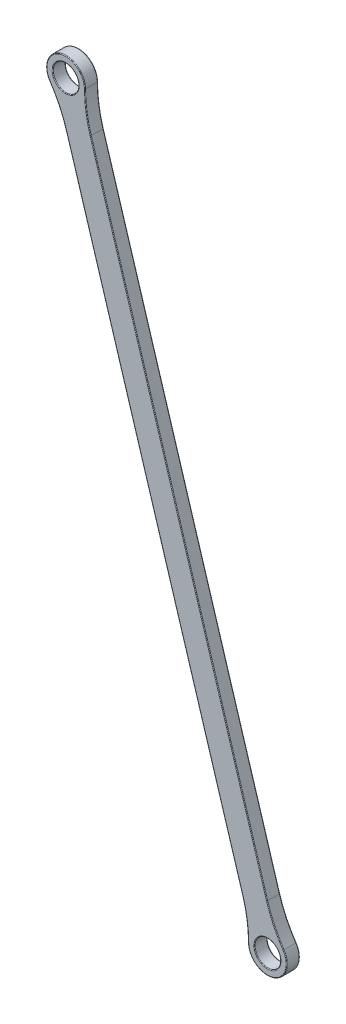
ISO-10303-21;
HEADER;
FILE_DESCRIPTION(('STEP AP214'),'2;1');
FILE_NAME('part.step','',(''),(''),'','','');
FILE_SCHEMA(('AUTOMOTIVE_DESIGN { 1 0 10303 214 1 1 1 1 }'));
ENDSEC;
DATA;
#1=APPLICATION_CONTEXT('core data for automotive mechanical design processes');
#2=APPLICATION_PROTOCOL_DEFINITION('international standard','automotive_design',2000,#1);
#3=PRODUCT_CONTEXT('',#1,'mechanical');
#4=PRODUCT('Part','Part','',(#3));
#5=PRODUCT_RELATED_PRODUCT_CATEGORY('part','',(#4));
#6=PRODUCT_DEFINITION_FORMATION('','',#4);
#7=PRODUCT_DEFINITION_CONTEXT('part definition',#1,'design');
#8=PRODUCT_DEFINITION('design','',#6,#7);
#9=PRODUCT_DEFINITION_SHAPE('','',#8);
#10=(LENGTH_UNIT() NAMED_UNIT(*) SI_UNIT(.MILLI.,.METRE.));
#11=(NAMED_UNIT(*) PLANE_ANGLE_UNIT() SI_UNIT($,.RADIAN.));
#12=(NAMED_UNIT(*) SI_UNIT($,.STERADIAN.) SOLID_ANGLE_UNIT());
#13=UNCERTAINTY_MEASURE_WITH_UNIT(LENGTH_MEASURE(1.E-05),#10,'distance_accuracy_value','');
#14=(GEOMETRIC_REPRESENTATION_CONTEXT(3) GLOBAL_UNCERTAINTY_ASSIGNED_CONTEXT((#13)) GLOBAL_UNIT_ASSIGNED_CONTEXT((#10,
#11,#12)) REPRESENTATION_CONTEXT('',''));
#15=CARTESIAN_POINT('',(0.,0.,0.));
#16=DIRECTION('',(0.,0.,1.));
#17=DIRECTION('',(1.,0.,0.));
#18=AXIS2_PLACEMENT_3D('',#15,#16,#17);
#19=CARTESIAN_POINT('',(33.7467217571438,59.4755059448647,-3.));
#20=DIRECTION('',(0.,0.,1.));
#21=DIRECTION('',(1.,0.,0.));
#22=AXIS2_PLACEMENT_3D('',#19,#20,#21);
#23=CYLINDRICAL_SURFACE('',#22,4.5);
#24=DIRECTION('',(0.,0.,1.));
#25=VECTOR('',#24,1.);
#26=CARTESIAN_POINT('',(29.2467307681306,59.4665004576648,-3.));
#27=LINE('',#26,#25);
#28=CARTESIAN_POINT('',(29.2467307681306,59.4665004576648,-0.15));
#29=VERTEX_POINT('',#28);
#30=CARTESIAN_POINT('',(29.2467307681306,59.4665004576648,-2.85));
#31=VERTEX_POINT('',#30);
#32=EDGE_CURVE('E306',#29,#31,#27,.F.);
#33=ORIENTED_EDGE('',*,*,#32,.T.);
#34=CARTESIAN_POINT('',(33.7467217571438,59.4755059448647,-2.85));
#35=DIRECTION('',(0.,0.,1.));
#36=DIRECTION('',(1.,0.,0.));
#37=AXIS2_PLACEMENT_3D('',#34,#35,#36);
#38=CIRCLE('',#37,4.5);
#39=CARTESIAN_POINT('',(37.4760941121765,61.9937954114508,-2.85));
#40=VERTEX_POINT('',#39);
#41=EDGE_CURVE('E221',#31,#40,#38,.T.);
#42=ORIENTED_EDGE('',*,*,#41,.T.);
#43=DIRECTION('',(0.,0.,1.));
#44=VECTOR('',#43,1.);
#45=CARTESIAN_POINT('',(37.4760941121765,61.9937954114508,-3.));
#46=LINE('',#45,#44);
#47=CARTESIAN_POINT('',(37.4760941121765,61.9937954114508,-0.15));
#48=VERTEX_POINT('',#47);
#49=EDGE_CURVE('E300',#40,#48,#46,.T.);
#50=ORIENTED_EDGE('',*,*,#49,.T.);
#51=CARTESIAN_POINT('',(33.7467217571438,59.4755059448647,-0.15));
#52=DIRECTION('',(0.,0.,1.));
#53=DIRECTION('',(1.,0.,0.));
#54=AXIS2_PLACEMENT_3D('',#51,#52,#53);
#55=CIRCLE('',#54,4.5);
#56=EDGE_CURVE('E219',#48,#29,#55,.F.);
#57=ORIENTED_EDGE('',*,*,#56,.T.);
#58=EDGE_LOOP('',(#33,#42,#50,#57));
#59=FACE_BOUND('',#58,.T.);
#60=ADVANCED_FACE('F35',(#59),#23,.T.);
#61=CARTESIAN_POINT('',(44.6615403100759,13.7158709289012,-3.));
#62=DIRECTION('',(0.955936146025531,0.293574666348876,0.));
#63=DIRECTION('',(-0.293574666348876,0.955936146025531,0.));
#64=AXIS2_PLACEMENT_3D('',#61,#62,#63);
#65=PLANE('',#64);
#66=DIRECTION('',(0.,0.,1.));
#67=VECTOR('',#66,1.);
#68=CARTESIAN_POINT('',(-13.1389951998274,201.925643388923,-3.));
#69=LINE('',#68,#67);
#70=CARTESIAN_POINT('',(-13.1389951998274,201.925643388923,-0.15));
#71=VERTEX_POINT('',#70);
#72=CARTESIAN_POINT('',(-13.1389951998274,201.925643388923,-2.85));
#73=VERTEX_POINT('',#72);
#74=EDGE_CURVE('E334',#71,#73,#69,.F.);
#75=ORIENTED_EDGE('',*,*,#74,.T.);
#76=DIRECTION('',(-0.293574666348876,0.955936146025531,0.));
#77=VECTOR('',#76,1.);
#78=CARTESIAN_POINT('',(44.6615403100759,13.7158709289012,-2.85));
#79=LINE('',#78,#77);
#80=CARTESIAN_POINT('',(27.9248752221417,68.2137038667982,-2.85));
#81=VERTEX_POINT('',#80);
#82=EDGE_CURVE('E213',#73,#81,#79,.F.);
#83=ORIENTED_EDGE('',*,*,#82,.T.);
#84=DIRECTION('',(0.,0.,1.));
#85=VECTOR('',#84,1.);
#86=CARTESIAN_POINT('',(27.9248752221417,68.2137038667982,-3.));
#87=LINE('',#86,#85);
#88=CARTESIAN_POINT('',(27.9248752221417,68.2137038667982,-0.15));
#89=VERTEX_POINT('',#88);
#90=EDGE_CURVE('E337',#81,#89,#87,.T.);
#91=ORIENTED_EDGE('',*,*,#90,.T.);
#92=DIRECTION('',(-0.293574666348876,0.955936146025531,0.));
#93=VECTOR('',#92,1.);
#94=CARTESIAN_POINT('',(-13.1389951998274,201.925643388923,-0.15));
#95=LINE('',#94,#93);
#96=EDGE_CURVE('E211',#89,#71,#95,.T.);
#97=ORIENTED_EDGE('',*,*,#96,.T.);
#98=EDGE_LOOP('',(#75,#83,#91,#97));
#99=FACE_BOUND('',#98,.T.);
#100=ADVANCED_FACE('F368',(#99),#65,.F.);
#101=CARTESIAN_POINT('',(-13.2252248586763,212.42528930895,-3.));
#102=DIRECTION('',(0.,0.,1.));
#103=DIRECTION('',(1.,0.,0.));
#104=AXIS2_PLACEMENT_3D('',#101,#102,#103);
#105=CYLINDRICAL_SURFACE('',#104,4.5);
#106=DIRECTION('',(0.,0.,1.));
#107=VECTOR('',#106,1.);
#108=CARTESIAN_POINT('',(-8.7252338696631,212.43429479615,-3.));
#109=LINE('',#108,#107);
#110=CARTESIAN_POINT('',(-8.7252338696631,212.43429479615,-0.15));
#111=VERTEX_POINT('',#110);
#112=CARTESIAN_POINT('',(-8.7252338696631,212.43429479615,-2.85));
#113=VERTEX_POINT('',#112);
#114=EDGE_CURVE('E262',#111,#113,#109,.F.);
#115=ORIENTED_EDGE('',*,*,#114,.T.);
#116=CARTESIAN_POINT('',(-13.2252248586763,212.42528930895,-2.85));
#117=DIRECTION('',(0.,0.,1.));
#118=DIRECTION('',(1.,0.,0.));
#119=AXIS2_PLACEMENT_3D('',#116,#117,#118);
#120=CIRCLE('',#119,4.5);
#121=CARTESIAN_POINT('',(-16.954597213709,209.906999842364,-2.85));
#122=VERTEX_POINT('',#121);
#123=EDGE_CURVE('E204',#113,#122,#120,.T.);
#124=ORIENTED_EDGE('',*,*,#123,.T.);
#125=DIRECTION('',(0.,0.,1.));
#126=VECTOR('',#125,1.);
#127=CARTESIAN_POINT('',(-16.954597213709,209.906999842364,-3.));
#128=LINE('',#127,#126);
#129=CARTESIAN_POINT('',(-16.954597213709,209.906999842364,-0.15));
#130=VERTEX_POINT('',#129);
#131=EDGE_CURVE('E342',#122,#130,#128,.T.);
#132=ORIENTED_EDGE('',*,*,#131,.T.);
#133=CARTESIAN_POINT('',(-13.2252248586763,212.42528930895,-0.15));
#134=DIRECTION('',(0.,0.,1.));
#135=DIRECTION('',(1.,0.,0.));
#136=AXIS2_PLACEMENT_3D('',#133,#134,#135);
#137=CIRCLE('',#136,4.5);
#138=EDGE_CURVE('E202',#130,#111,#137,.F.);
#139=ORIENTED_EDGE('',*,*,#138,.T.);
#140=EDGE_LOOP('',(#115,#124,#132,#139));
#141=FACE_BOUND('',#140,.T.);
#142=ADVANCED_FACE('F349',(#141),#105,.T.);
#143=CARTESIAN_POINT('',(50.3971571862291,15.4773189269944,-3.));
#144=DIRECTION('',(0.955936146025531,0.293574666348876,0.));
#145=DIRECTION('',(-0.293574666348876,0.955936146025531,0.));
#146=AXIS2_PLACEMENT_3D('',#143,#144,#145);
#147=PLANE('',#146);
#148=DIRECTION('',(0.,0.,-1.));
#149=VECTOR('',#148,1.);
#150=CARTESIAN_POINT('',(33.6604920982949,69.9751518648915,-3.));
#151=LINE('',#150,#149);
#152=CARTESIAN_POINT('',(33.6604920982949,69.9751518648915,-0.15));
#153=VERTEX_POINT('',#152);
#154=CARTESIAN_POINT('',(33.6604920982949,69.9751518648915,-2.85));
#155=VERTEX_POINT('',#154);
#156=EDGE_CURVE('E302',#153,#155,#151,.T.);
#157=ORIENTED_EDGE('',*,*,#156,.T.);
#158=DIRECTION('',(-0.293574666348876,0.955936146025531,0.));
#159=VECTOR('',#158,1.);
#160=CARTESIAN_POINT('',(-7.40337832367419,203.687091387016,-2.85));
#161=LINE('',#160,#159);
#162=CARTESIAN_POINT('',(-7.40337832367416,203.687091387016,-2.85));
#163=VERTEX_POINT('',#162);
#164=EDGE_CURVE('E196',#155,#163,#161,.T.);
#165=ORIENTED_EDGE('',*,*,#164,.T.);
#166=DIRECTION('',(0.,0.,-1.));
#167=VECTOR('',#166,1.);
#168=CARTESIAN_POINT('',(-7.40337832367416,203.687091387016,0.));
#169=LINE('',#168,#167);
#170=CARTESIAN_POINT('',(-7.40337832367416,203.687091387016,-0.15));
#171=VERTEX_POINT('',#170);
#172=EDGE_CURVE('E310',#163,#171,#169,.F.);
#173=ORIENTED_EDGE('',*,*,#172,.T.);
#174=DIRECTION('',(-0.293574666348876,0.955936146025531,0.));
#175=VECTOR('',#174,1.);
#176=CARTESIAN_POINT('',(50.3971571862291,15.4773189269944,-0.15));
#177=LINE('',#176,#175);
#178=EDGE_CURVE('E194',#171,#153,#177,.F.);
#179=ORIENTED_EDGE('',*,*,#178,.T.);
#180=EDGE_LOOP('',(#157,#165,#173,#179));
#181=FACE_BOUND('',#180,.T.);
#182=ADVANCED_FACE('F333',(#181),#147,.T.);
#183=CARTESIAN_POINT('',(-13.2252248586763,212.42528930895,-3.));
#184=DIRECTION('',(0.,0.,1.));
#185=DIRECTION('',(1.,0.,0.));
#186=AXIS2_PLACEMENT_3D('',#183,#184,#185);
#187=CYLINDRICAL_SURFACE('',#186,3.);
#188=CARTESIAN_POINT('',(-13.2252248586763,212.42528930895,-2.85));
#189=DIRECTION('',(0.,0.,1.));
#190=DIRECTION('',(1.,0.,0.));
#191=AXIS2_PLACEMENT_3D('',#188,#189,#190);
#192=CIRCLE('',#191,3.);
#193=CARTESIAN_POINT('',(-10.2252248586763,212.42528930895,-2.85));
#194=VERTEX_POINT('',#193);
#195=EDGE_CURVE('E226',#194,#194,#192,.F.);
#196=ORIENTED_EDGE('',*,*,#195,.T.);
#197=EDGE_LOOP('',(#196));
#198=FACE_BOUND('',#197,.T.);
#199=CARTESIAN_POINT('',(-13.2252248586763,212.42528930895,-0.15));
#200=DIRECTION('',(0.,0.,1.));
#201=DIRECTION('',(1.,0.,0.));
#202=AXIS2_PLACEMENT_3D('',#199,#200,#201);
#203=CIRCLE('',#202,3.);
#204=CARTESIAN_POINT('',(-10.2252248586763,212.42528930895,-0.15));
#205=VERTEX_POINT('',#204);
#206=EDGE_CURVE('E223',#205,#205,#203,.T.);
#207=ORIENTED_EDGE('',*,*,#206,.T.);
#208=EDGE_LOOP('',(#207));
#209=FACE_BOUND('',#208,.T.);
#210=ADVANCED_FACE('F403',(#198,#209),#187,.F.);
#211=CARTESIAN_POINT('',(33.7467217571438,59.4755059448647,-3.));
#212=DIRECTION('',(0.,0.,1.));
#213=DIRECTION('',(1.,0.,0.));
#214=AXIS2_PLACEMENT_3D('',#211,#212,#213);
#215=CYLINDRICAL_SURFACE('',#214,3.);
#216=CARTESIAN_POINT('',(33.7467217571438,59.4755059448647,-2.85));
#217=DIRECTION('',(0.,0.,1.));
#218=DIRECTION('',(1.,0.,0.));
#219=AXIS2_PLACEMENT_3D('',#216,#217,#218);
#220=CIRCLE('',#219,3.);
#221=CARTESIAN_POINT('',(36.7467217571438,59.4755059448647,-2.85));
#222=VERTEX_POINT('',#221);
#223=EDGE_CURVE('E188',#222,#222,#220,.F.);
#224=ORIENTED_EDGE('',*,*,#223,.T.);
#225=EDGE_LOOP('',(#224));
#226=FACE_BOUND('',#225,.T.);
#227=CARTESIAN_POINT('',(33.7467217571438,59.4755059448647,-0.15));
#228=DIRECTION('',(0.,0.,1.));
#229=DIRECTION('',(1.,0.,0.));
#230=AXIS2_PLACEMENT_3D('',#227,#228,#229);
#231=CIRCLE('',#230,3.);
#232=CARTESIAN_POINT('',(36.7467217571438,59.4755059448647,-0.15));
#233=VERTEX_POINT('',#232);
#234=EDGE_CURVE('E180',#233,#233,#231,.T.);
#235=ORIENTED_EDGE('',*,*,#234,.T.);
#236=EDGE_LOOP('',(#235));
#237=FACE_BOUND('',#236,.T.);
#238=ADVANCED_FACE('F405',(#226,#237),#215,.F.);
#239=CARTESIAN_POINT('',(0.,0.,-3.));
#240=DIRECTION('',(0.,0.,1.));
#241=DIRECTION('',(1.,0.,0.));
#242=AXIS2_PLACEMENT_3D('',#239,#240,#241);
#243=PLANE('',#242);
#244=CARTESIAN_POINT('',(33.7467217571438,59.4755059448647,-3.));
#245=DIRECTION('',(0.,0.,1.));
#246=DIRECTION('',(1.,0.,0.));
#247=AXIS2_PLACEMENT_3D('',#244,#245,#246);
#248=CIRCLE('',#247,3.15);
#249=CARTESIAN_POINT('',(36.8967217571438,59.4755059448647,-3.));
#250=VERTEX_POINT('',#249);
#251=EDGE_CURVE('E177',#250,#250,#248,.T.);
#252=ORIENTED_EDGE('',*,*,#251,.T.);
#253=EDGE_LOOP('',(#252));
#254=FACE_BOUND('',#253,.T.);
#255=DIRECTION('',(-0.293574666348876,0.955936146025531,0.));
#256=VECTOR('',#255,1.);
#257=CARTESIAN_POINT('',(33.517101676391,69.9311156649392,-3.));
#258=LINE('',#257,#256);
#259=CARTESIAN_POINT('',(-7.54676874557798,203.643055187064,-3.));
#260=VERTEX_POINT('',#259);
#261=CARTESIAN_POINT('',(33.517101676391,69.9311156649391,-3.));
#262=VERTEX_POINT('',#261);
#263=EDGE_CURVE('E175',#260,#262,#258,.F.);
#264=ORIENTED_EDGE('',*,*,#263,.T.);
#265=CARTESIAN_POINT('',(62.3385764790608,78.7823918553578,-3.));
#266=DIRECTION('',(0.,0.,1.));
#267=DIRECTION('',(1.,0.,0.));
#268=AXIS2_PLACEMENT_3D('',#265,#266,#267);
#269=CIRCLE('',#268,30.15);
#270=CARTESIAN_POINT('',(37.3517817003421,61.9098524292313,-3.));
#271=VERTEX_POINT('',#270);
#272=EDGE_CURVE('E155',#262,#271,#269,.T.);
#273=ORIENTED_EDGE('',*,*,#272,.T.);
#274=CARTESIAN_POINT('',(33.7467217571438,59.4755059448647,-3.));
#275=DIRECTION('',(0.,0.,1.));
#276=DIRECTION('',(1.,0.,0.));
#277=AXIS2_PLACEMENT_3D('',#274,#275,#276);
#278=CIRCLE('',#277,4.35);
#279=CARTESIAN_POINT('',(29.3967304677644,59.4668006405715,-3.));
#280=VERTEX_POINT('',#279);
#281=EDGE_CURVE('E163',#271,#280,#278,.F.);
#282=ORIENTED_EDGE('',*,*,#281,.T.);
#283=CARTESIAN_POINT('',(-0.753209158624276,59.4064638763319,-3.));
#284=DIRECTION('',(0.,0.,1.));
#285=DIRECTION('',(1.,0.,0.));
#286=AXIS2_PLACEMENT_3D('',#283,#284,#285);
#287=CIRCLE('',#286,30.15);
#288=CARTESIAN_POINT('',(28.0682656440455,68.2577400667505,-3.));
#289=VERTEX_POINT('',#288);
#290=EDGE_CURVE('E169',#280,#289,#287,.T.);
#291=ORIENTED_EDGE('',*,*,#290,.T.);
#292=DIRECTION('',(-0.293574666348876,0.955936146025531,0.));
#293=VECTOR('',#292,1.);
#294=CARTESIAN_POINT('',(44.8049307319797,13.7599071288535,-3.));
#295=LINE('',#294,#293);
#296=CARTESIAN_POINT('',(-12.9956047779235,201.969679588875,-3.));
#297=VERTEX_POINT('',#296);
#298=EDGE_CURVE('E315',#289,#297,#295,.T.);
#299=ORIENTED_EDGE('',*,*,#298,.T.);
#300=CARTESIAN_POINT('',(-41.8170795805933,193.118403398457,-3.));
#301=DIRECTION('',(0.,0.,1.));
#302=DIRECTION('',(1.,0.,0.));
#303=AXIS2_PLACEMENT_3D('',#300,#301,#302);
#304=CIRCLE('',#303,30.15);
#305=CARTESIAN_POINT('',(-16.8302848018746,209.990942824583,-3.));
#306=VERTEX_POINT('',#305);
#307=EDGE_CURVE('E317',#297,#306,#304,.T.);
#308=ORIENTED_EDGE('',*,*,#307,.T.);
#309=CARTESIAN_POINT('',(-13.2252248586763,212.42528930895,-3.));
#310=DIRECTION('',(0.,0.,1.));
#311=DIRECTION('',(1.,0.,0.));
#312=AXIS2_PLACEMENT_3D('',#309,#310,#311);
#313=CIRCLE('',#312,4.35);
#314=CARTESIAN_POINT('',(-8.87523356929687,212.433994613243,-3.));
#315=VERTEX_POINT('',#314);
#316=EDGE_CURVE('E319',#306,#315,#313,.F.);
#317=ORIENTED_EDGE('',*,*,#316,.T.);
#318=CARTESIAN_POINT('',(21.2747060570918,212.494331377483,-3.));
#319=DIRECTION('',(0.,0.,1.));
#320=DIRECTION('',(1.,0.,0.));
#321=AXIS2_PLACEMENT_3D('',#318,#319,#320);
#322=CIRCLE('',#321,30.15);
#323=EDGE_CURVE('E182',#315,#260,#322,.T.);
#324=ORIENTED_EDGE('',*,*,#323,.T.);
#325=EDGE_LOOP('',(#264,#273,#282,#291,#299,#308,#317,#324));
#326=FACE_BOUND('',#325,.T.);
#327=CARTESIAN_POINT('',(-13.2252248586763,212.42528930895,-3.));
#328=DIRECTION('',(0.,0.,1.));
#329=DIRECTION('',(1.,0.,0.));
#330=AXIS2_PLACEMENT_3D('',#327,#328,#329);
#331=CIRCLE('',#330,3.15);
#332=CARTESIAN_POINT('',(-10.0752248586763,212.42528930895,-3.));
#333=VERTEX_POINT('',#332);
#334=EDGE_CURVE('E170',#333,#333,#331,.T.);
#335=ORIENTED_EDGE('',*,*,#334,.T.);
#336=EDGE_LOOP('',(#335));
#337=FACE_BOUND('',#336,.T.);
#338=ADVANCED_FACE('F172',(#254,#326,#337),#243,.F.);
#339=CARTESIAN_POINT('',(0.,0.,0.));
#340=DIRECTION('',(0.,0.,1.));
#341=DIRECTION('',(1.,0.,0.));
#342=AXIS2_PLACEMENT_3D('',#339,#340,#341);
#343=PLANE('',#342);
#344=CARTESIAN_POINT('',(33.7467217571438,59.4755059448647,0.));
#345=DIRECTION('',(0.,0.,1.));
#346=DIRECTION('',(1.,0.,0.));
#347=AXIS2_PLACEMENT_3D('',#344,#345,#346);
#348=CIRCLE('',#347,3.15);
#349=CARTESIAN_POINT('',(36.8967217571438,59.4755059448647,0.));
#350=VERTEX_POINT('',#349);
#351=EDGE_CURVE('E11',#350,#350,#348,.F.);
#352=ORIENTED_EDGE('',*,*,#351,.T.);
#353=EDGE_LOOP('',(#352));
#354=FACE_BOUND('',#353,.T.);
#355=CARTESIAN_POINT('',(-13.2252248586763,212.42528930895,0.));
#356=DIRECTION('',(0.,0.,1.));
#357=DIRECTION('',(1.,0.,0.));
#358=AXIS2_PLACEMENT_3D('',#355,#356,#357);
#359=CIRCLE('',#358,4.35);
#360=CARTESIAN_POINT('',(-8.87523356929687,212.433994613243,0.));
#361=VERTEX_POINT('',#360);
#362=CARTESIAN_POINT('',(-16.8302848018746,209.990942824583,0.));
#363=VERTEX_POINT('',#362);
#364=EDGE_CURVE('E52',#361,#363,#359,.T.);
#365=ORIENTED_EDGE('',*,*,#364,.T.);
#366=CARTESIAN_POINT('',(-41.8170795805933,193.118403398457,0.));
#367=DIRECTION('',(0.,0.,1.));
#368=DIRECTION('',(1.,0.,0.));
#369=AXIS2_PLACEMENT_3D('',#366,#367,#368);
#370=CIRCLE('',#369,30.15);
#371=CARTESIAN_POINT('',(-12.9956047779235,201.969679588875,0.));
#372=VERTEX_POINT('',#371);
#373=EDGE_CURVE('E44',#363,#372,#370,.F.);
#374=ORIENTED_EDGE('',*,*,#373,.T.);
#375=DIRECTION('',(-0.293574666348876,0.955936146025531,0.));
#376=VECTOR('',#375,1.);
#377=CARTESIAN_POINT('',(28.0682656440455,68.2577400667505,0.));
#378=LINE('',#377,#376);
#379=CARTESIAN_POINT('',(28.0682656440455,68.2577400667505,0.));
#380=VERTEX_POINT('',#379);
#381=EDGE_CURVE('E232',#372,#380,#378,.F.);
#382=ORIENTED_EDGE('',*,*,#381,.T.);
#383=CARTESIAN_POINT('',(-0.753209158624276,59.4064638763319,0.));
#384=DIRECTION('',(0.,0.,1.));
#385=DIRECTION('',(1.,0.,0.));
#386=AXIS2_PLACEMENT_3D('',#383,#384,#385);
#387=CIRCLE('',#386,30.15);
#388=CARTESIAN_POINT('',(29.3967304677644,59.4668006405715,0.));
#389=VERTEX_POINT('',#388);
#390=EDGE_CURVE('E234',#380,#389,#387,.F.);
#391=ORIENTED_EDGE('',*,*,#390,.T.);
#392=CARTESIAN_POINT('',(33.7467217571438,59.4755059448647,0.));
#393=DIRECTION('',(0.,0.,1.));
#394=DIRECTION('',(1.,0.,0.));
#395=AXIS2_PLACEMENT_3D('',#392,#393,#394);
#396=CIRCLE('',#395,4.35);
#397=CARTESIAN_POINT('',(37.3517817003421,61.9098524292313,0.));
#398=VERTEX_POINT('',#397);
#399=EDGE_CURVE('E236',#389,#398,#396,.T.);
#400=ORIENTED_EDGE('',*,*,#399,.T.);
#401=CARTESIAN_POINT('',(62.3385764790608,78.7823918553578,0.));
#402=DIRECTION('',(0.,0.,1.));
#403=DIRECTION('',(1.,0.,0.));
#404=AXIS2_PLACEMENT_3D('',#401,#402,#403);
#405=CIRCLE('',#404,30.15);
#406=CARTESIAN_POINT('',(33.517101676391,69.9311156649391,0.));
#407=VERTEX_POINT('',#406);
#408=EDGE_CURVE('E238',#398,#407,#405,.F.);
#409=ORIENTED_EDGE('',*,*,#408,.T.);
#410=DIRECTION('',(-0.293574666348876,0.955936146025531,0.));
#411=VECTOR('',#410,1.);
#412=CARTESIAN_POINT('',(50.2537667643253,15.4332827270421,0.));
#413=LINE('',#412,#411);
#414=CARTESIAN_POINT('',(-7.54676874557798,203.643055187064,0.));
#415=VERTEX_POINT('',#414);
#416=EDGE_CURVE('E240',#407,#415,#413,.T.);
#417=ORIENTED_EDGE('',*,*,#416,.T.);
#418=CARTESIAN_POINT('',(21.2747060570918,212.494331377483,0.));
#419=DIRECTION('',(0.,0.,1.));
#420=DIRECTION('',(1.,0.,0.));
#421=AXIS2_PLACEMENT_3D('',#418,#419,#420);
#422=CIRCLE('',#421,30.15);
#423=EDGE_CURVE('E57',#415,#361,#422,.F.);
#424=ORIENTED_EDGE('',*,*,#423,.T.);
#425=EDGE_LOOP('',(#365,#374,#382,#391,#400,#409,#417,#424));
#426=FACE_BOUND('',#425,.T.);
#427=CARTESIAN_POINT('',(-13.2252248586763,212.42528930895,0.));
#428=DIRECTION('',(0.,0.,1.));
#429=DIRECTION('',(1.,0.,0.));
#430=AXIS2_PLACEMENT_3D('',#427,#428,#429);
#431=CIRCLE('',#430,3.15);
#432=CARTESIAN_POINT('',(-10.0752248586763,212.42528930895,0.));
#433=VERTEX_POINT('',#432);
#434=EDGE_CURVE('E229',#433,#433,#431,.F.);
#435=ORIENTED_EDGE('',*,*,#434,.T.);
#436=EDGE_LOOP('',(#435));
#437=FACE_BOUND('',#436,.T.);
#438=ADVANCED_FACE('F392',(#354,#426,#437),#343,.T.);
#439=CARTESIAN_POINT('',(-41.8170795805933,193.118403398457,-3.));
#440=DIRECTION('',(0.,0.,1.));
#441=DIRECTION('',(1.,0.,0.));
#442=AXIS2_PLACEMENT_3D('',#439,#440,#441);
#443=CYLINDRICAL_SURFACE('',#442,30.);
#444=ORIENTED_EDGE('',*,*,#131,.F.);
#445=CARTESIAN_POINT('',(-41.8170795805933,193.118403398457,-2.85));
#446=DIRECTION('',(0.,0.,1.));
#447=DIRECTION('',(1.,0.,0.));
#448=AXIS2_PLACEMENT_3D('',#445,#446,#447);
#449=CIRCLE('',#448,30.);
#450=EDGE_CURVE('E209',#122,#73,#449,.F.);
#451=ORIENTED_EDGE('',*,*,#450,.T.);
#452=ORIENTED_EDGE('',*,*,#74,.F.);
#453=CARTESIAN_POINT('',(-41.8170795805933,193.118403398457,-0.15));
#454=DIRECTION('',(0.,0.,1.));
#455=DIRECTION('',(1.,0.,0.));
#456=AXIS2_PLACEMENT_3D('',#453,#454,#455);
#457=CIRCLE('',#456,30.);
#458=EDGE_CURVE('E206',#71,#130,#457,.T.);
#459=ORIENTED_EDGE('',*,*,#458,.T.);
#460=EDGE_LOOP('',(#444,#451,#452,#459));
#461=FACE_BOUND('',#460,.T.);
#462=ADVANCED_FACE('F365',(#461),#443,.F.);
#463=CARTESIAN_POINT('',(21.2747060570918,212.494331377483,-3.));
#464=DIRECTION('',(0.,0.,1.));
#465=DIRECTION('',(1.,0.,0.));
#466=AXIS2_PLACEMENT_3D('',#463,#464,#465);
#467=CYLINDRICAL_SURFACE('',#466,30.);
#468=ORIENTED_EDGE('',*,*,#172,.F.);
#469=CARTESIAN_POINT('',(21.2747060570918,212.494331377483,-2.85));
#470=DIRECTION('',(0.,0.,1.));
#471=DIRECTION('',(1.,0.,0.));
#472=AXIS2_PLACEMENT_3D('',#469,#470,#471);
#473=CIRCLE('',#472,30.);
#474=EDGE_CURVE('E200',#163,#113,#473,.F.);
#475=ORIENTED_EDGE('',*,*,#474,.T.);
#476=ORIENTED_EDGE('',*,*,#114,.F.);
#477=CARTESIAN_POINT('',(21.2747060570918,212.494331377483,-0.15));
#478=DIRECTION('',(0.,0.,1.));
#479=DIRECTION('',(1.,0.,0.));
#480=AXIS2_PLACEMENT_3D('',#477,#478,#479);
#481=CIRCLE('',#480,30.);
#482=EDGE_CURVE('E198',#111,#171,#481,.T.);
#483=ORIENTED_EDGE('',*,*,#482,.T.);
#484=EDGE_LOOP('',(#468,#475,#476,#483));
#485=FACE_BOUND('',#484,.T.);
#486=ADVANCED_FACE('F383',(#485),#467,.F.);
#487=CARTESIAN_POINT('',(62.3385764790608,78.7823918553578,-3.));
#488=DIRECTION('',(0.,0.,1.));
#489=DIRECTION('',(1.,0.,0.));
#490=AXIS2_PLACEMENT_3D('',#487,#488,#489);
#491=CYLINDRICAL_SURFACE('',#490,30.);
#492=ORIENTED_EDGE('',*,*,#49,.F.);
#493=CARTESIAN_POINT('',(62.3385764790608,78.7823918553578,-2.85));
#494=DIRECTION('',(0.,0.,1.));
#495=DIRECTION('',(1.,0.,0.));
#496=AXIS2_PLACEMENT_3D('',#493,#494,#495);
#497=CIRCLE('',#496,30.);
#498=EDGE_CURVE('E157',#40,#155,#497,.F.);
#499=ORIENTED_EDGE('',*,*,#498,.T.);
#500=ORIENTED_EDGE('',*,*,#156,.F.);
#501=CARTESIAN_POINT('',(62.3385764790608,78.7823918553578,-0.15));
#502=DIRECTION('',(0.,0.,1.));
#503=DIRECTION('',(1.,0.,0.));
#504=AXIS2_PLACEMENT_3D('',#501,#502,#503);
#505=CIRCLE('',#504,30.);
#506=EDGE_CURVE('E191',#153,#48,#505,.T.);
#507=ORIENTED_EDGE('',*,*,#506,.T.);
#508=EDGE_LOOP('',(#492,#499,#500,#507));
#509=FACE_BOUND('',#508,.T.);
#510=ADVANCED_FACE('F299',(#509),#491,.F.);
#511=CARTESIAN_POINT('',(-0.753209158624276,59.4064638763319,-3.));
#512=DIRECTION('',(0.,0.,1.));
#513=DIRECTION('',(1.,0.,0.));
#514=AXIS2_PLACEMENT_3D('',#511,#512,#513);
#515=CYLINDRICAL_SURFACE('',#514,30.);
#516=ORIENTED_EDGE('',*,*,#90,.F.);
#517=CARTESIAN_POINT('',(-0.753209158624276,59.4064638763319,-2.85));
#518=DIRECTION('',(0.,0.,1.));
#519=DIRECTION('',(1.,0.,0.));
#520=AXIS2_PLACEMENT_3D('',#517,#518,#519);
#521=CIRCLE('',#520,30.);
#522=EDGE_CURVE('E217',#81,#31,#521,.F.);
#523=ORIENTED_EDGE('',*,*,#522,.T.);
#524=ORIENTED_EDGE('',*,*,#32,.F.);
#525=CARTESIAN_POINT('',(-0.753209158624276,59.4064638763319,-0.15));
#526=DIRECTION('',(0.,0.,1.));
#527=DIRECTION('',(1.,0.,0.));
#528=AXIS2_PLACEMENT_3D('',#525,#526,#527);
#529=CIRCLE('',#528,30.);
#530=EDGE_CURVE('E215',#29,#89,#529,.T.);
#531=ORIENTED_EDGE('',*,*,#530,.T.);
#532=EDGE_LOOP('',(#516,#523,#524,#531));
#533=FACE_BOUND('',#532,.T.);
#534=ADVANCED_FACE('F390',(#533),#515,.F.);
#535=CARTESIAN_POINT('',(33.7467217571438,59.4755059448647,-2.85));
#536=DIRECTION('',(0.,0.,1.));
#537=DIRECTION('',(1.,0.,0.));
#538=AXIS2_PLACEMENT_3D('',#535,#536,#537);
#539=TOROIDAL_SURFACE('',#538,3.15,0.15);
#540=ORIENTED_EDGE('',*,*,#223,.F.);
#541=EDGE_LOOP('',(#540));
#542=FACE_BOUND('',#541,.T.);
#543=ORIENTED_EDGE('',*,*,#251,.F.);
#544=EDGE_LOOP('',(#543));
#545=FACE_BOUND('',#544,.T.);
#546=ADVANCED_FACE('F493',(#542,#545),#539,.T.);
#547=CARTESIAN_POINT('',(-41.8170795805933,193.118403398457,-2.85));
#548=DIRECTION('',(0.,0.,1.));
#549=DIRECTION('',(1.,0.,0.));
#550=AXIS2_PLACEMENT_3D('',#547,#548,#549);
#551=TOROIDAL_SURFACE('',#550,30.15,0.15);
#552=CARTESIAN_POINT('',(-12.9956047779235,201.969679588875,-2.85));
#553=DIRECTION('',(0.293574666348866,-0.955936146025534,0.));
#554=DIRECTION('',(0.955936146025535,0.293574666348866,0.));
#555=AXIS2_PLACEMENT_3D('',#552,#553,#554);
#556=CIRCLE('',#555,0.15);
#557=EDGE_CURVE('E256',#73,#297,#556,.T.);
#558=ORIENTED_EDGE('',*,*,#557,.F.);
#559=ORIENTED_EDGE('',*,*,#450,.F.);
#560=CARTESIAN_POINT('',(-16.8302848018746,209.990942824583,-2.85));
#561=DIRECTION('',(-0.559619881463538,0.828749412229496,0.));
#562=DIRECTION('',(-0.828749412229497,-0.559619881463538,0.));
#563=AXIS2_PLACEMENT_3D('',#560,#561,#562);
#564=CIRCLE('',#563,0.15);
#565=EDGE_CURVE('E259',#306,#122,#564,.T.);
#566=ORIENTED_EDGE('',*,*,#565,.F.);
#567=ORIENTED_EDGE('',*,*,#307,.F.);
#568=EDGE_LOOP('',(#558,#559,#566,#567));
#569=FACE_BOUND('',#568,.T.);
#570=ADVANCED_FACE('F361',(#569),#551,.T.);
#571=CARTESIAN_POINT('',(-13.2252248586763,212.42528930895,-2.85));
#572=DIRECTION('',(0.,0.,1.));
#573=DIRECTION('',(1.,0.,0.));
#574=AXIS2_PLACEMENT_3D('',#571,#572,#573);
#575=TOROIDAL_SURFACE('',#574,4.35,0.15);
#576=ORIENTED_EDGE('',*,*,#565,.T.);
#577=ORIENTED_EDGE('',*,*,#123,.F.);
#578=CARTESIAN_POINT('',(-8.87523356929687,212.433994613243,-2.85));
#579=DIRECTION('',(0.00200121937780442,-0.999997997558496,0.));
#580=DIRECTION('',(0.999997997558496,0.00200121937780441,0.));
#581=AXIS2_PLACEMENT_3D('',#578,#579,#580);
#582=CIRCLE('',#581,0.15);
#583=EDGE_CURVE('E253',#315,#113,#582,.T.);
#584=ORIENTED_EDGE('',*,*,#583,.F.);
#585=ORIENTED_EDGE('',*,*,#316,.F.);
#586=EDGE_LOOP('',(#576,#577,#584,#585));
#587=FACE_BOUND('',#586,.T.);
#588=ADVANCED_FACE('F355',(#587),#575,.T.);
#589=CARTESIAN_POINT('',(44.8049307319797,13.7599071288535,-2.85));
#590=DIRECTION('',(-0.293574666348876,0.955936146025531,0.));
#591=DIRECTION('',(-0.955936146025531,-0.293574666348876,0.));
#592=AXIS2_PLACEMENT_3D('',#589,#590,#591);
#593=CYLINDRICAL_SURFACE('',#592,0.15);
#594=ORIENTED_EDGE('',*,*,#557,.T.);
#595=ORIENTED_EDGE('',*,*,#298,.F.);
#596=CARTESIAN_POINT('',(28.0682656440455,68.2577400667505,-2.85));
#597=DIRECTION('',(0.293574666348869,-0.955936146025534,0.));
#598=DIRECTION('',(0.955936146025534,0.293574666348869,0.));
#599=AXIS2_PLACEMENT_3D('',#596,#597,#598);
#600=CIRCLE('',#599,0.15);
#601=EDGE_CURVE('E250',#81,#289,#600,.T.);
#602=ORIENTED_EDGE('',*,*,#601,.F.);
#603=ORIENTED_EDGE('',*,*,#82,.F.);
#604=EDGE_LOOP('',(#594,#595,#602,#603));
#605=FACE_BOUND('',#604,.T.);
#606=ADVANCED_FACE('F520',(#605),#593,.T.);
#607=CARTESIAN_POINT('',(21.2747060570918,212.494331377483,-2.85));
#608=DIRECTION('',(0.,0.,1.));
#609=DIRECTION('',(1.,0.,0.));
#610=AXIS2_PLACEMENT_3D('',#607,#608,#609);
#611=TOROIDAL_SURFACE('',#610,30.15,0.15);
#612=ORIENTED_EDGE('',*,*,#583,.T.);
#613=ORIENTED_EDGE('',*,*,#474,.F.);
#614=CARTESIAN_POINT('',(-7.54676874557798,203.643055187064,-2.85));
#615=DIRECTION('',(0.293574666348859,-0.955936146025536,0.));
#616=DIRECTION('',(0.955936146025537,0.29357466634886,0.));
#617=AXIS2_PLACEMENT_3D('',#614,#615,#616);
#618=CIRCLE('',#617,0.15);
#619=EDGE_CURVE('E247',#260,#163,#618,.T.);
#620=ORIENTED_EDGE('',*,*,#619,.F.);
#621=ORIENTED_EDGE('',*,*,#323,.F.);
#622=EDGE_LOOP('',(#612,#613,#620,#621));
#623=FACE_BOUND('',#622,.T.);
#624=ADVANCED_FACE('F326',(#623),#611,.T.);
#625=CARTESIAN_POINT('',(-0.753209158624276,59.4064638763319,-2.85));
#626=DIRECTION('',(0.,0.,1.));
#627=DIRECTION('',(1.,0.,0.));
#628=AXIS2_PLACEMENT_3D('',#625,#626,#627);
#629=TOROIDAL_SURFACE('',#628,30.15,0.15);
#630=ORIENTED_EDGE('',*,*,#601,.T.);
#631=ORIENTED_EDGE('',*,*,#290,.F.);
#632=CARTESIAN_POINT('',(29.3967304677644,59.4668006405715,-2.85));
#633=DIRECTION('',(0.00200121937775816,-0.999997997558496,0.));
#634=DIRECTION('',(0.999997997558496,0.00200121937775816,0.));
#635=AXIS2_PLACEMENT_3D('',#632,#633,#634);
#636=CIRCLE('',#635,0.15);
#637=EDGE_CURVE('E166',#31,#280,#636,.T.);
#638=ORIENTED_EDGE('',*,*,#637,.F.);
#639=ORIENTED_EDGE('',*,*,#522,.F.);
#640=EDGE_LOOP('',(#630,#631,#638,#639));
#641=FACE_BOUND('',#640,.T.);
#642=ADVANCED_FACE('F538',(#641),#629,.T.);
#643=CARTESIAN_POINT('',(50.2537667643253,15.4332827270421,-2.85));
#644=DIRECTION('',(0.293574666348876,-0.955936146025531,0.));
#645=DIRECTION('',(0.955936146025531,0.293574666348876,0.));
#646=AXIS2_PLACEMENT_3D('',#643,#644,#645);
#647=CYLINDRICAL_SURFACE('',#646,0.15);
#648=ORIENTED_EDGE('',*,*,#619,.T.);
#649=ORIENTED_EDGE('',*,*,#164,.F.);
#650=CARTESIAN_POINT('',(33.517101676391,69.9311156649391,-2.85));
#651=DIRECTION('',(0.293574666348863,-0.955936146025535,0.));
#652=DIRECTION('',(0.955936146025536,0.293574666348863,0.));
#653=AXIS2_PLACEMENT_3D('',#650,#651,#652);
#654=CIRCLE('',#653,0.15);
#655=EDGE_CURVE('E160',#262,#155,#654,.T.);
#656=ORIENTED_EDGE('',*,*,#655,.F.);
#657=ORIENTED_EDGE('',*,*,#263,.F.);
#658=EDGE_LOOP('',(#648,#649,#656,#657));
#659=FACE_BOUND('',#658,.T.);
#660=ADVANCED_FACE('F329',(#659),#647,.T.);
#661=CARTESIAN_POINT('',(33.7467217571438,59.4755059448647,-2.85));
#662=DIRECTION('',(0.,0.,1.));
#663=DIRECTION('',(1.,0.,0.));
#664=AXIS2_PLACEMENT_3D('',#661,#662,#663);
#665=TOROIDAL_SURFACE('',#664,4.35,0.15);
#666=ORIENTED_EDGE('',*,*,#637,.T.);
#667=ORIENTED_EDGE('',*,*,#281,.F.);
#668=CARTESIAN_POINT('',(37.3517817003421,61.9098524292312,-2.85));
#669=DIRECTION('',(-0.55961988146358,0.828749412229468,0.));
#670=DIRECTION('',(-0.828749412229468,-0.55961988146358,0.));
#671=AXIS2_PLACEMENT_3D('',#668,#669,#670);
#672=CIRCLE('',#671,0.15);
#673=EDGE_CURVE('E151',#40,#271,#672,.T.);
#674=ORIENTED_EDGE('',*,*,#673,.F.);
#675=ORIENTED_EDGE('',*,*,#41,.F.);
#676=EDGE_LOOP('',(#666,#667,#674,#675));
#677=FACE_BOUND('',#676,.T.);
#678=ADVANCED_FACE('F164',(#677),#665,.T.);
#679=CARTESIAN_POINT('',(62.3385764790608,78.7823918553578,-2.85));
#680=DIRECTION('',(0.,0.,1.));
#681=DIRECTION('',(1.,0.,0.));
#682=AXIS2_PLACEMENT_3D('',#679,#680,#681);
#683=TOROIDAL_SURFACE('',#682,30.15,0.15);
#684=ORIENTED_EDGE('',*,*,#655,.T.);
#685=ORIENTED_EDGE('',*,*,#498,.F.);
#686=ORIENTED_EDGE('',*,*,#673,.T.);
#687=ORIENTED_EDGE('',*,*,#272,.F.);
#688=EDGE_LOOP('',(#684,#685,#686,#687));
#689=FACE_BOUND('',#688,.T.);
#690=ADVANCED_FACE('F153',(#689),#683,.T.);
#691=CARTESIAN_POINT('',(-13.2252248586763,212.42528930895,-2.85));
#692=DIRECTION('',(0.,0.,1.));
#693=DIRECTION('',(1.,0.,0.));
#694=AXIS2_PLACEMENT_3D('',#691,#692,#693);
#695=TOROIDAL_SURFACE('',#694,3.15,0.15);
#696=ORIENTED_EDGE('',*,*,#195,.F.);
#697=EDGE_LOOP('',(#696));
#698=FACE_BOUND('',#697,.T.);
#699=ORIENTED_EDGE('',*,*,#334,.F.);
#700=EDGE_LOOP('',(#699));
#701=FACE_BOUND('',#700,.T.);
#702=ADVANCED_FACE('F572',(#698,#701),#695,.T.);
#703=CARTESIAN_POINT('',(33.7467217571438,59.4755059448647,-0.15));
#704=DIRECTION('',(0.,0.,1.));
#705=DIRECTION('',(1.,0.,0.));
#706=AXIS2_PLACEMENT_3D('',#703,#704,#705);
#707=TOROIDAL_SURFACE('',#706,3.15,0.15);
#708=ORIENTED_EDGE('',*,*,#351,.F.);
#709=EDGE_LOOP('',(#708));
#710=FACE_BOUND('',#709,.T.);
#711=ORIENTED_EDGE('',*,*,#234,.F.);
#712=EDGE_LOOP('',(#711));
#713=FACE_BOUND('',#712,.T.);
#714=ADVANCED_FACE('F581',(#710,#713),#707,.T.);
#715=CARTESIAN_POINT('',(62.3385764790608,78.7823918553578,-0.15));
#716=DIRECTION('',(0.,0.,1.));
#717=DIRECTION('',(1.,0.,0.));
#718=AXIS2_PLACEMENT_3D('',#715,#716,#717);
#719=TOROIDAL_SURFACE('',#718,30.15,0.15);
#720=CARTESIAN_POINT('',(37.3517817003421,61.9098524292313,-0.15));
#721=DIRECTION('',(0.559619881463548,-0.828749412229489,0.));
#722=DIRECTION('',(0.828749412229489,0.559619881463549,0.));
#723=AXIS2_PLACEMENT_3D('',#720,#721,#722);
#724=CIRCLE('',#723,0.15);
#725=EDGE_CURVE('E278',#48,#398,#724,.T.);
#726=ORIENTED_EDGE('',*,*,#725,.F.);
#727=ORIENTED_EDGE('',*,*,#506,.F.);
#728=CARTESIAN_POINT('',(33.517101676391,69.9311156649391,-0.15));
#729=DIRECTION('',(-0.293574666348876,0.955936146025531,0.));
#730=DIRECTION('',(-0.955936146025532,-0.293574666348876,0.));
#731=AXIS2_PLACEMENT_3D('',#728,#729,#730);
#732=CIRCLE('',#731,0.15);
#733=EDGE_CURVE('E39',#407,#153,#732,.T.);
#734=ORIENTED_EDGE('',*,*,#733,.F.);
#735=ORIENTED_EDGE('',*,*,#408,.F.);
#736=EDGE_LOOP('',(#726,#727,#734,#735));
#737=FACE_BOUND('',#736,.T.);
#738=ADVANCED_FACE('F294',(#737),#719,.T.);
#739=CARTESIAN_POINT('',(50.2537667643253,15.4332827270421,-0.15));
#740=DIRECTION('',(-0.293574666348876,0.955936146025531,0.));
#741=DIRECTION('',(-0.955936146025531,-0.293574666348876,0.));
#742=AXIS2_PLACEMENT_3D('',#739,#740,#741);
#743=CYLINDRICAL_SURFACE('',#742,0.15);
#744=ORIENTED_EDGE('',*,*,#733,.T.);
#745=ORIENTED_EDGE('',*,*,#178,.F.);
#746=CARTESIAN_POINT('',(-7.54676874557798,203.643055187064,-0.15));
#747=DIRECTION('',(-0.293574666348858,0.955936146025537,0.));
#748=DIRECTION('',(-0.955936146025537,-0.293574666348858,0.));
#749=AXIS2_PLACEMENT_3D('',#746,#747,#748);
#750=CIRCLE('',#749,0.15);
#751=EDGE_CURVE('E276',#415,#171,#750,.T.);
#752=ORIENTED_EDGE('',*,*,#751,.F.);
#753=ORIENTED_EDGE('',*,*,#416,.F.);
#754=EDGE_LOOP('',(#744,#745,#752,#753));
#755=FACE_BOUND('',#754,.T.);
#756=ADVANCED_FACE('F289',(#755),#743,.T.);
#757=CARTESIAN_POINT('',(33.7467217571438,59.4755059448647,-0.15));
#758=DIRECTION('',(0.,0.,1.));
#759=DIRECTION('',(1.,0.,0.));
#760=AXIS2_PLACEMENT_3D('',#757,#758,#759);
#761=TOROIDAL_SURFACE('',#760,4.35,0.15);
#762=ORIENTED_EDGE('',*,*,#725,.T.);
#763=ORIENTED_EDGE('',*,*,#399,.F.);
#764=CARTESIAN_POINT('',(29.3967304677644,59.4668006405715,-0.15));
#765=DIRECTION('',(-0.00200121937775816,0.999997997558496,0.));
#766=DIRECTION('',(-0.999997997558496,-0.00200121937775816,0.));
#767=AXIS2_PLACEMENT_3D('',#764,#765,#766);
#768=CIRCLE('',#767,0.15);
#769=EDGE_CURVE('E273',#29,#389,#768,.T.);
#770=ORIENTED_EDGE('',*,*,#769,.F.);
#771=ORIENTED_EDGE('',*,*,#56,.F.);
#772=EDGE_LOOP('',(#762,#763,#770,#771));
#773=FACE_BOUND('',#772,.T.);
#774=ADVANCED_FACE('F607',(#773),#761,.T.);
#775=CARTESIAN_POINT('',(21.2747060570918,212.494331377483,-0.15));
#776=DIRECTION('',(0.,0.,1.));
#777=DIRECTION('',(1.,0.,0.));
#778=AXIS2_PLACEMENT_3D('',#775,#776,#777);
#779=TOROIDAL_SURFACE('',#778,30.15,0.15);
#780=ORIENTED_EDGE('',*,*,#751,.T.);
#781=ORIENTED_EDGE('',*,*,#482,.F.);
#782=CARTESIAN_POINT('',(-8.87523356929687,212.433994613243,-0.15));
#783=DIRECTION('',(-0.00200121937780439,0.999997997558496,0.));
#784=DIRECTION('',(-0.999997997558496,-0.00200121937780439,0.));
#785=AXIS2_PLACEMENT_3D('',#782,#783,#784);
#786=CIRCLE('',#785,0.15);
#787=EDGE_CURVE('E270',#361,#111,#786,.T.);
#788=ORIENTED_EDGE('',*,*,#787,.F.);
#789=ORIENTED_EDGE('',*,*,#423,.F.);
#790=EDGE_LOOP('',(#780,#781,#788,#789));
#791=FACE_BOUND('',#790,.T.);
#792=ADVANCED_FACE('F382',(#791),#779,.T.);
#793=CARTESIAN_POINT('',(-0.753209158624276,59.4064638763319,-0.15));
#794=DIRECTION('',(0.,0.,1.));
#795=DIRECTION('',(1.,0.,0.));
#796=AXIS2_PLACEMENT_3D('',#793,#794,#795);
#797=TOROIDAL_SURFACE('',#796,30.15,0.15);
#798=ORIENTED_EDGE('',*,*,#769,.T.);
#799=ORIENTED_EDGE('',*,*,#390,.F.);
#800=CARTESIAN_POINT('',(28.0682656440455,68.2577400667505,-0.15));
#801=DIRECTION('',(-0.293574666348869,0.955936146025534,0.));
#802=DIRECTION('',(-0.955936146025534,-0.293574666348869,0.));
#803=AXIS2_PLACEMENT_3D('',#800,#801,#802);
#804=CIRCLE('',#803,0.15);
#805=EDGE_CURVE('E267',#89,#380,#804,.T.);
#806=ORIENTED_EDGE('',*,*,#805,.F.);
#807=ORIENTED_EDGE('',*,*,#530,.F.);
#808=EDGE_LOOP('',(#798,#799,#806,#807));
#809=FACE_BOUND('',#808,.T.);
#810=ADVANCED_FACE('F624',(#809),#797,.T.);
#811=CARTESIAN_POINT('',(-13.2252248586763,212.42528930895,-0.15));
#812=DIRECTION('',(0.,0.,1.));
#813=DIRECTION('',(1.,0.,0.));
#814=AXIS2_PLACEMENT_3D('',#811,#812,#813);
#815=TOROIDAL_SURFACE('',#814,4.35,0.15);
#816=ORIENTED_EDGE('',*,*,#787,.T.);
#817=ORIENTED_EDGE('',*,*,#138,.F.);
#818=CARTESIAN_POINT('',(-16.8302848018746,209.990942824583,-0.15));
#819=DIRECTION('',(0.559619881463549,-0.828749412229489,0.));
#820=DIRECTION('',(0.828749412229489,0.559619881463549,0.));
#821=AXIS2_PLACEMENT_3D('',#818,#819,#820);
#822=CIRCLE('',#821,0.15);
#823=EDGE_CURVE('E265',#363,#130,#822,.T.);
#824=ORIENTED_EDGE('',*,*,#823,.F.);
#825=ORIENTED_EDGE('',*,*,#364,.F.);
#826=EDGE_LOOP('',(#816,#817,#824,#825));
#827=FACE_BOUND('',#826,.T.);
#828=ADVANCED_FACE('F380',(#827),#815,.T.);
#829=CARTESIAN_POINT('',(44.8049307319797,13.7599071288535,-0.15));
#830=DIRECTION('',(0.293574666348876,-0.955936146025531,0.));
#831=DIRECTION('',(0.955936146025531,0.293574666348876,0.));
#832=AXIS2_PLACEMENT_3D('',#829,#830,#831);
#833=CYLINDRICAL_SURFACE('',#832,0.15);
#834=ORIENTED_EDGE('',*,*,#805,.T.);
#835=ORIENTED_EDGE('',*,*,#381,.F.);
#836=CARTESIAN_POINT('',(-12.9956047779235,201.969679588875,-0.15));
#837=DIRECTION('',(-0.293574666348866,0.955936146025534,0.));
#838=DIRECTION('',(-0.955936146025535,-0.293574666348866,0.));
#839=AXIS2_PLACEMENT_3D('',#836,#837,#838);
#840=CIRCLE('',#839,0.15);
#841=EDGE_CURVE('E263',#71,#372,#840,.T.);
#842=ORIENTED_EDGE('',*,*,#841,.F.);
#843=ORIENTED_EDGE('',*,*,#96,.F.);
#844=EDGE_LOOP('',(#834,#835,#842,#843));
#845=FACE_BOUND('',#844,.T.);
#846=ADVANCED_FACE('F374',(#845),#833,.T.);
#847=CARTESIAN_POINT('',(-41.8170795805933,193.118403398457,-0.15));
#848=DIRECTION('',(0.,0.,1.));
#849=DIRECTION('',(1.,0.,0.));
#850=AXIS2_PLACEMENT_3D('',#847,#848,#849);
#851=TOROIDAL_SURFACE('',#850,30.15,0.15);
#852=ORIENTED_EDGE('',*,*,#823,.T.);
#853=ORIENTED_EDGE('',*,*,#458,.F.);
#854=ORIENTED_EDGE('',*,*,#841,.T.);
#855=ORIENTED_EDGE('',*,*,#373,.F.);
#856=EDGE_LOOP('',(#852,#853,#854,#855));
#857=FACE_BOUND('',#856,.T.);
#858=ADVANCED_FACE('F378',(#857),#851,.T.);
#859=CARTESIAN_POINT('',(-13.2252248586763,212.42528930895,-0.15));
#860=DIRECTION('',(0.,0.,1.));
#861=DIRECTION('',(1.,0.,0.));
#862=AXIS2_PLACEMENT_3D('',#859,#860,#861);
#863=TOROIDAL_SURFACE('',#862,3.15,0.15);
#864=ORIENTED_EDGE('',*,*,#434,.F.);
#865=EDGE_LOOP('',(#864));
#866=FACE_BOUND('',#865,.T.);
#867=ORIENTED_EDGE('',*,*,#206,.F.);
#868=EDGE_LOOP('',(#867));
#869=FACE_BOUND('',#868,.T.);
#870=ADVANCED_FACE('F37',(#866,#869),#863,.T.);
#871=CLOSED_SHELL('',(#60,#100,#142,#182,#210,#238,#338,#438,#462,#486,#510,#534,#546,#570,#588,
#606,#624,#642,#660,#678,#690,#702,#714,#738,#756,#774,#792,#810,#828,#846,#858,#870));
#872=MANIFOLD_SOLID_BREP('B2',#871);
#873=ADVANCED_BREP_SHAPE_REPRESENTATION('',(#18,#872),#14);
#874=SHAPE_DEFINITION_REPRESENTATION(#9,#873);
ENDSEC;
END-ISO-10303-21;
